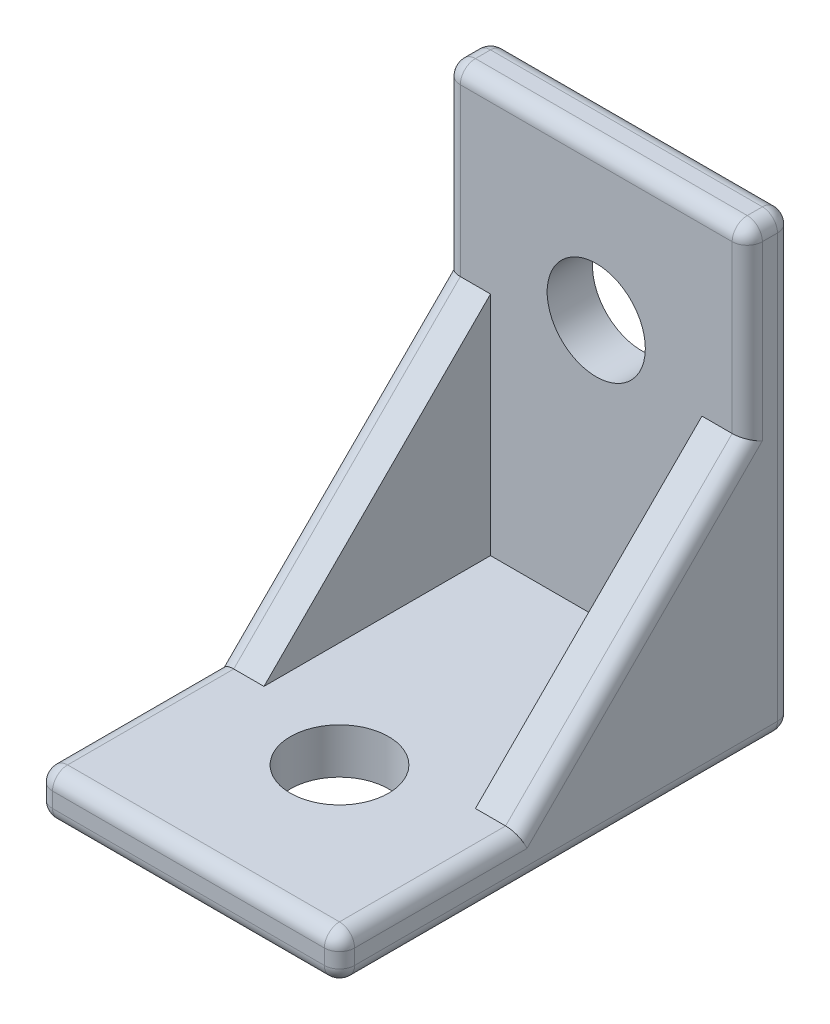
ISO-10303-21;
HEADER;
FILE_DESCRIPTION(('STEP AP214'),'2;1');
FILE_NAME('part.step','',(''),(''),'','','');
FILE_SCHEMA(('AUTOMOTIVE_DESIGN { 1 0 10303 214 1 1 1 1 }'));
ENDSEC;
DATA;
#1=APPLICATION_CONTEXT('core data for automotive mechanical design processes');
#2=APPLICATION_PROTOCOL_DEFINITION('international standard','automotive_design',2000,#1);
#3=PRODUCT_CONTEXT('',#1,'mechanical');
#4=PRODUCT('Part','Part','',(#3));
#5=PRODUCT_RELATED_PRODUCT_CATEGORY('part','',(#4));
#6=PRODUCT_DEFINITION_FORMATION('','',#4);
#7=PRODUCT_DEFINITION_CONTEXT('part definition',#1,'design');
#8=PRODUCT_DEFINITION('design','',#6,#7);
#9=PRODUCT_DEFINITION_SHAPE('','',#8);
#10=(LENGTH_UNIT() NAMED_UNIT(*) SI_UNIT(.MILLI.,.METRE.));
#11=(NAMED_UNIT(*) PLANE_ANGLE_UNIT() SI_UNIT($,.RADIAN.));
#12=(NAMED_UNIT(*) SI_UNIT($,.STERADIAN.) SOLID_ANGLE_UNIT());
#13=UNCERTAINTY_MEASURE_WITH_UNIT(LENGTH_MEASURE(1.E-05),#10,'distance_accuracy_value','');
#14=(GEOMETRIC_REPRESENTATION_CONTEXT(3) GLOBAL_UNCERTAINTY_ASSIGNED_CONTEXT((#13)) GLOBAL_UNIT_ASSIGNED_CONTEXT((#10,
#11,#12)) REPRESENTATION_CONTEXT('',''));
#15=CARTESIAN_POINT('',(0.,0.,0.));
#16=DIRECTION('',(0.,0.,1.));
#17=DIRECTION('',(1.,0.,0.));
#18=AXIS2_PLACEMENT_3D('',#15,#16,#17);
#19=CARTESIAN_POINT('',(0.,3.,0.));
#20=DIRECTION('',(0.,1.,0.));
#21=DIRECTION('',(0.,0.,1.));
#22=AXIS2_PLACEMENT_3D('',#19,#20,#21);
#23=PLANE('',#22);
#24=CARTESIAN_POINT('',(-10.,3.,-10.));
#25=DIRECTION('',(0.,1.,0.));
#26=DIRECTION('',(0.,0.,1.));
#27=AXIS2_PLACEMENT_3D('',#24,#25,#26);
#28=CIRCLE('',#27,3.25);
#29=CARTESIAN_POINT('',(-10.,3.,-6.75));
#30=VERTEX_POINT('',#29);
#31=EDGE_CURVE('E238',#30,#30,#28,.T.);
#32=ORIENTED_EDGE('',*,*,#31,.F.);
#33=EDGE_LOOP('',(#32));
#34=FACE_BOUND('',#33,.T.);
#35=DIRECTION('',(-1.,0.,0.));
#36=VECTOR('',#35,1.);
#37=CARTESIAN_POINT('',(-17.,3.,-12.));
#38=LINE('',#37,#36);
#39=CARTESIAN_POINT('',(-17.,3.,-12.));
#40=VERTEX_POINT('',#39);
#41=CARTESIAN_POINT('',(-19.,3.,-12.));
#42=VERTEX_POINT('',#41);
#43=EDGE_CURVE('E220',#40,#42,#38,.T.);
#44=ORIENTED_EDGE('',*,*,#43,.T.);
#45=DIRECTION('',(0.,0.,1.));
#46=VECTOR('',#45,1.);
#47=CARTESIAN_POINT('',(-19.,3.,0.));
#48=LINE('',#47,#46);
#49=CARTESIAN_POINT('',(-19.,3.,-1.));
#50=VERTEX_POINT('',#49);
#51=EDGE_CURVE('E286',#42,#50,#48,.T.);
#52=ORIENTED_EDGE('',*,*,#51,.T.);
#53=DIRECTION('',(1.,0.,0.));
#54=VECTOR('',#53,1.);
#55=CARTESIAN_POINT('',(0.,3.,-1.));
#56=LINE('',#55,#54);
#57=CARTESIAN_POINT('',(-1.,3.,-1.));
#58=VERTEX_POINT('',#57);
#59=EDGE_CURVE('E283',#50,#58,#56,.T.);
#60=ORIENTED_EDGE('',*,*,#59,.T.);
#61=DIRECTION('',(0.,0.,-1.));
#62=VECTOR('',#61,1.);
#63=CARTESIAN_POINT('',(-1.,3.,-12.));
#64=LINE('',#63,#62);
#65=CARTESIAN_POINT('',(-1.,3.,-12.));
#66=VERTEX_POINT('',#65);
#67=EDGE_CURVE('E280',#58,#66,#64,.T.);
#68=ORIENTED_EDGE('',*,*,#67,.T.);
#69=DIRECTION('',(1.,0.,0.));
#70=VECTOR('',#69,1.);
#71=CARTESIAN_POINT('',(-3.,3.,-12.));
#72=LINE('',#71,#70);
#73=CARTESIAN_POINT('',(-3.,3.,-12.));
#74=VERTEX_POINT('',#73);
#75=EDGE_CURVE('E214',#74,#66,#72,.T.);
#76=ORIENTED_EDGE('',*,*,#75,.F.);
#77=DIRECTION('',(0.,0.,-1.));
#78=VECTOR('',#77,1.);
#79=CARTESIAN_POINT('',(-3.,3.,-27.));
#80=LINE('',#79,#78);
#81=CARTESIAN_POINT('',(-3.,3.,-27.));
#82=VERTEX_POINT('',#81);
#83=EDGE_CURVE('E206',#74,#82,#80,.T.);
#84=ORIENTED_EDGE('',*,*,#83,.T.);
#85=DIRECTION('',(1.,0.,0.));
#86=VECTOR('',#85,1.);
#87=CARTESIAN_POINT('',(-20.,3.,-27.));
#88=LINE('',#87,#86);
#89=CARTESIAN_POINT('',(-17.,3.,-27.));
#90=VERTEX_POINT('',#89);
#91=EDGE_CURVE('E188',#90,#82,#88,.T.);
#92=ORIENTED_EDGE('',*,*,#91,.F.);
#93=DIRECTION('',(0.,0.,-1.));
#94=VECTOR('',#93,1.);
#95=CARTESIAN_POINT('',(-17.,3.,-27.));
#96=LINE('',#95,#94);
#97=EDGE_CURVE('E490',#40,#90,#96,.T.);
#98=ORIENTED_EDGE('',*,*,#97,.F.);
#99=EDGE_LOOP('',(#44,#52,#60,#68,#76,#84,#92,#98));
#100=FACE_BOUND('',#99,.T.);
#101=ADVANCED_FACE('F38',(#34,#100),#23,.T.);
#102=CARTESIAN_POINT('',(-20.,30.,-27.));
#103=DIRECTION('',(0.,0.,-1.));
#104=DIRECTION('',(-1.,0.,0.));
#105=AXIS2_PLACEMENT_3D('',#102,#103,#104);
#106=PLANE('',#105);
#107=CARTESIAN_POINT('',(-10.,20.,-27.));
#108=DIRECTION('',(0.,0.,1.));
#109=DIRECTION('',(1.,0.,0.));
#110=AXIS2_PLACEMENT_3D('',#107,#108,#109);
#111=CIRCLE('',#110,3.25);
#112=CARTESIAN_POINT('',(-6.75,20.,-27.));
#113=VERTEX_POINT('',#112);
#114=EDGE_CURVE('E229',#113,#113,#111,.T.);
#115=ORIENTED_EDGE('',*,*,#114,.F.);
#116=EDGE_LOOP('',(#115));
#117=FACE_BOUND('',#116,.T.);
#118=DIRECTION('',(1.,0.,0.));
#119=VECTOR('',#118,1.);
#120=CARTESIAN_POINT('',(-20.,29.,-27.));
#121=LINE('',#120,#119);
#122=CARTESIAN_POINT('',(-1.,29.,-27.));
#123=VERTEX_POINT('',#122);
#124=CARTESIAN_POINT('',(-19.,29.,-27.));
#125=VERTEX_POINT('',#124);
#126=EDGE_CURVE('E274',#123,#125,#121,.F.);
#127=ORIENTED_EDGE('',*,*,#126,.T.);
#128=DIRECTION('',(0.,-1.,0.));
#129=VECTOR('',#128,1.);
#130=CARTESIAN_POINT('',(-19.,30.,-27.));
#131=LINE('',#130,#129);
#132=CARTESIAN_POINT('',(-19.,18.,-27.));
#133=VERTEX_POINT('',#132);
#134=EDGE_CURVE('E277',#125,#133,#131,.T.);
#135=ORIENTED_EDGE('',*,*,#134,.T.);
#136=DIRECTION('',(-1.,0.,0.));
#137=VECTOR('',#136,1.);
#138=CARTESIAN_POINT('',(-17.,18.,-27.));
#139=LINE('',#138,#137);
#140=CARTESIAN_POINT('',(-17.,18.,-27.));
#141=VERTEX_POINT('',#140);
#142=EDGE_CURVE('E216',#141,#133,#139,.T.);
#143=ORIENTED_EDGE('',*,*,#142,.F.);
#144=DIRECTION('',(0.,1.,0.));
#145=VECTOR('',#144,1.);
#146=CARTESIAN_POINT('',(-17.,18.,-27.));
#147=LINE('',#146,#145);
#148=EDGE_CURVE('E195',#90,#141,#147,.T.);
#149=ORIENTED_EDGE('',*,*,#148,.F.);
#150=ORIENTED_EDGE('',*,*,#91,.T.);
#151=DIRECTION('',(0.,1.,0.));
#152=VECTOR('',#151,1.);
#153=CARTESIAN_POINT('',(-3.,18.,-27.));
#154=LINE('',#153,#152);
#155=CARTESIAN_POINT('',(-3.,18.,-27.));
#156=VERTEX_POINT('',#155);
#157=EDGE_CURVE('E193',#82,#156,#154,.T.);
#158=ORIENTED_EDGE('',*,*,#157,.T.);
#159=DIRECTION('',(1.,0.,0.));
#160=VECTOR('',#159,1.);
#161=CARTESIAN_POINT('',(-3.,18.,-27.));
#162=LINE('',#161,#160);
#163=CARTESIAN_POINT('',(-1.,18.,-27.));
#164=VERTEX_POINT('',#163);
#165=EDGE_CURVE('E226',#156,#164,#162,.T.);
#166=ORIENTED_EDGE('',*,*,#165,.T.);
#167=DIRECTION('',(0.,-1.,0.));
#168=VECTOR('',#167,1.);
#169=CARTESIAN_POINT('',(-1.,30.,-27.));
#170=LINE('',#169,#168);
#171=EDGE_CURVE('E271',#164,#123,#170,.F.);
#172=ORIENTED_EDGE('',*,*,#171,.T.);
#173=EDGE_LOOP('',(#127,#135,#143,#149,#150,#158,#166,#172));
#174=FACE_BOUND('',#173,.T.);
#175=ADVANCED_FACE('F191',(#117,#174),#106,.F.);
#176=CARTESIAN_POINT('',(0.,0.,0.));
#177=DIRECTION('',(0.,1.,0.));
#178=DIRECTION('',(0.,0.,1.));
#179=AXIS2_PLACEMENT_3D('',#176,#177,#178);
#180=PLANE('',#179);
#181=DIRECTION('',(0.,0.,-1.));
#182=VECTOR('',#181,1.);
#183=CARTESIAN_POINT('',(-1.,0.,0.));
#184=LINE('',#183,#182);
#185=CARTESIAN_POINT('',(-1.,0.,-29.));
#186=VERTEX_POINT('',#185);
#187=CARTESIAN_POINT('',(-1.,0.,-1.));
#188=VERTEX_POINT('',#187);
#189=EDGE_CURVE('E305',#186,#188,#184,.F.);
#190=ORIENTED_EDGE('',*,*,#189,.T.);
#191=DIRECTION('',(1.,0.,0.));
#192=VECTOR('',#191,1.);
#193=CARTESIAN_POINT('',(0.,0.,-1.));
#194=LINE('',#193,#192);
#195=CARTESIAN_POINT('',(-19.,0.,-1.));
#196=VERTEX_POINT('',#195);
#197=EDGE_CURVE('E311',#188,#196,#194,.F.);
#198=ORIENTED_EDGE('',*,*,#197,.T.);
#199=DIRECTION('',(0.,0.,1.));
#200=VECTOR('',#199,1.);
#201=CARTESIAN_POINT('',(-19.,0.,0.));
#202=LINE('',#201,#200);
#203=CARTESIAN_POINT('',(-19.,0.,-29.));
#204=VERTEX_POINT('',#203);
#205=EDGE_CURVE('E308',#196,#204,#202,.F.);
#206=ORIENTED_EDGE('',*,*,#205,.T.);
#207=DIRECTION('',(-1.,0.,0.));
#208=VECTOR('',#207,1.);
#209=CARTESIAN_POINT('',(0.,0.,-29.));
#210=LINE('',#209,#208);
#211=EDGE_CURVE('E302',#204,#186,#210,.F.);
#212=ORIENTED_EDGE('',*,*,#211,.T.);
#213=EDGE_LOOP('',(#190,#198,#206,#212));
#214=FACE_BOUND('',#213,.T.);
#215=CARTESIAN_POINT('',(-10.,0.,-10.));
#216=DIRECTION('',(0.,1.,0.));
#217=DIRECTION('',(0.,0.,1.));
#218=AXIS2_PLACEMENT_3D('',#215,#216,#217);
#219=CIRCLE('',#218,3.25);
#220=CARTESIAN_POINT('',(-10.,0.,-6.75));
#221=VERTEX_POINT('',#220);
#222=EDGE_CURVE('E200',#221,#221,#219,.T.);
#223=ORIENTED_EDGE('',*,*,#222,.T.);
#224=EDGE_LOOP('',(#223));
#225=FACE_BOUND('',#224,.T.);
#226=ADVANCED_FACE('F607',(#214,#225),#180,.F.);
#227=CARTESIAN_POINT('',(0.,3.,0.));
#228=DIRECTION('',(-1.,0.,0.));
#229=DIRECTION('',(0.,0.,1.));
#230=AXIS2_PLACEMENT_3D('',#227,#228,#229);
#231=PLANE('',#230);
#232=DIRECTION('',(0.,0.,-1.));
#233=VECTOR('',#232,1.);
#234=CARTESIAN_POINT('',(0.,2.,0.));
#235=LINE('',#234,#233);
#236=CARTESIAN_POINT('',(0.,2.,-12.4142135623731));
#237=VERTEX_POINT('',#236);
#238=CARTESIAN_POINT('',(0.,2.,-1.));
#239=VERTEX_POINT('',#238);
#240=EDGE_CURVE('E56',#237,#239,#235,.F.);
#241=ORIENTED_EDGE('',*,*,#240,.T.);
#242=DIRECTION('',(0.,-1.,0.));
#243=VECTOR('',#242,1.);
#244=CARTESIAN_POINT('',(0.,3.,-1.));
#245=LINE('',#244,#243);
#246=CARTESIAN_POINT('',(0.,1.,-1.));
#247=VERTEX_POINT('',#246);
#248=EDGE_CURVE('E48',#239,#247,#245,.T.);
#249=ORIENTED_EDGE('',*,*,#248,.T.);
#250=DIRECTION('',(0.,0.,-1.));
#251=VECTOR('',#250,1.);
#252=CARTESIAN_POINT('',(0.,1.,0.));
#253=LINE('',#252,#251);
#254=CARTESIAN_POINT('',(0.,1.,-29.));
#255=VERTEX_POINT('',#254);
#256=EDGE_CURVE('E340',#247,#255,#253,.T.);
#257=ORIENTED_EDGE('',*,*,#256,.T.);
#258=DIRECTION('',(0.,-1.,0.));
#259=VECTOR('',#258,1.);
#260=CARTESIAN_POINT('',(0.,3.,-29.));
#261=LINE('',#260,#259);
#262=CARTESIAN_POINT('',(0.,29.,-29.));
#263=VERTEX_POINT('',#262);
#264=EDGE_CURVE('E343',#255,#263,#261,.F.);
#265=ORIENTED_EDGE('',*,*,#264,.T.);
#266=DIRECTION('',(0.,0.,-1.));
#267=VECTOR('',#266,1.);
#268=CARTESIAN_POINT('',(0.,29.,-27.));
#269=LINE('',#268,#267);
#270=CARTESIAN_POINT('',(0.,29.,-28.));
#271=VERTEX_POINT('',#270);
#272=EDGE_CURVE('E346',#263,#271,#269,.F.);
#273=ORIENTED_EDGE('',*,*,#272,.T.);
#274=DIRECTION('',(0.,-1.,0.));
#275=VECTOR('',#274,1.);
#276=CARTESIAN_POINT('',(0.,3.,-28.));
#277=LINE('',#276,#275);
#278=CARTESIAN_POINT('',(0.,17.5857864376269,-28.));
#279=VERTEX_POINT('',#278);
#280=EDGE_CURVE('E349',#271,#279,#277,.T.);
#281=ORIENTED_EDGE('',*,*,#280,.T.);
#282=DIRECTION('',(0.,-0.707106781186548,0.707106781186547));
#283=VECTOR('',#282,1.);
#284=CARTESIAN_POINT('',(0.,2.29289321881345,-12.7071067811866));
#285=LINE('',#284,#283);
#286=EDGE_CURVE('E61',#279,#237,#285,.T.);
#287=ORIENTED_EDGE('',*,*,#286,.T.);
#288=EDGE_LOOP('',(#241,#249,#257,#265,#273,#281,#287));
#289=FACE_BOUND('',#288,.T.);
#290=ADVANCED_FACE('F544',(#289),#231,.F.);
#291=CARTESIAN_POINT('',(0.,3.,-30.));
#292=DIRECTION('',(0.,0.,1.));
#293=DIRECTION('',(1.,0.,0.));
#294=AXIS2_PLACEMENT_3D('',#291,#292,#293);
#295=PLANE('',#294);
#296=DIRECTION('',(0.,-1.,0.));
#297=VECTOR('',#296,1.);
#298=CARTESIAN_POINT('',(-19.,3.,-30.));
#299=LINE('',#298,#297);
#300=CARTESIAN_POINT('',(-19.,1.,-30.));
#301=VERTEX_POINT('',#300);
#302=CARTESIAN_POINT('',(-19.,29.,-30.));
#303=VERTEX_POINT('',#302);
#304=EDGE_CURVE('E264',#301,#303,#299,.F.);
#305=ORIENTED_EDGE('',*,*,#304,.T.);
#306=DIRECTION('',(-1.,0.,0.));
#307=VECTOR('',#306,1.);
#308=CARTESIAN_POINT('',(0.,29.,-30.));
#309=LINE('',#308,#307);
#310=CARTESIAN_POINT('',(-1.,29.,-30.));
#311=VERTEX_POINT('',#310);
#312=EDGE_CURVE('E267',#303,#311,#309,.F.);
#313=ORIENTED_EDGE('',*,*,#312,.T.);
#314=DIRECTION('',(0.,-1.,0.));
#315=VECTOR('',#314,1.);
#316=CARTESIAN_POINT('',(-1.,3.,-30.));
#317=LINE('',#316,#315);
#318=CARTESIAN_POINT('',(-1.,1.,-30.));
#319=VERTEX_POINT('',#318);
#320=EDGE_CURVE('E261',#311,#319,#317,.T.);
#321=ORIENTED_EDGE('',*,*,#320,.T.);
#322=DIRECTION('',(-1.,0.,0.));
#323=VECTOR('',#322,1.);
#324=CARTESIAN_POINT('',(0.,1.,-30.));
#325=LINE('',#324,#323);
#326=EDGE_CURVE('E258',#319,#301,#325,.T.);
#327=ORIENTED_EDGE('',*,*,#326,.T.);
#328=EDGE_LOOP('',(#305,#313,#321,#327));
#329=FACE_BOUND('',#328,.T.);
#330=CARTESIAN_POINT('',(-10.,20.,-30.));
#331=DIRECTION('',(0.,0.,1.));
#332=DIRECTION('',(1.,0.,0.));
#333=AXIS2_PLACEMENT_3D('',#330,#331,#332);
#334=CIRCLE('',#333,3.25);
#335=CARTESIAN_POINT('',(-6.75,20.,-30.));
#336=VERTEX_POINT('',#335);
#337=EDGE_CURVE('E201',#336,#336,#334,.T.);
#338=ORIENTED_EDGE('',*,*,#337,.T.);
#339=EDGE_LOOP('',(#338));
#340=FACE_BOUND('',#339,.T.);
#341=ADVANCED_FACE('F621',(#329,#340),#295,.F.);
#342=CARTESIAN_POINT('',(-20.,3.,0.));
#343=DIRECTION('',(1.,0.,0.));
#344=DIRECTION('',(0.,0.,-1.));
#345=AXIS2_PLACEMENT_3D('',#342,#343,#344);
#346=PLANE('',#345);
#347=DIRECTION('',(0.,0.,1.));
#348=VECTOR('',#347,1.);
#349=CARTESIAN_POINT('',(-20.,1.,0.));
#350=LINE('',#349,#348);
#351=CARTESIAN_POINT('',(-20.,1.,-29.));
#352=VERTEX_POINT('',#351);
#353=CARTESIAN_POINT('',(-20.,1.,-1.));
#354=VERTEX_POINT('',#353);
#355=EDGE_CURVE('E330',#352,#354,#350,.T.);
#356=ORIENTED_EDGE('',*,*,#355,.T.);
#357=DIRECTION('',(0.,-1.,0.));
#358=VECTOR('',#357,1.);
#359=CARTESIAN_POINT('',(-20.,3.,-1.));
#360=LINE('',#359,#358);
#361=CARTESIAN_POINT('',(-20.,2.,-1.));
#362=VERTEX_POINT('',#361);
#363=EDGE_CURVE('E333',#354,#362,#360,.F.);
#364=ORIENTED_EDGE('',*,*,#363,.T.);
#365=DIRECTION('',(0.,0.,1.));
#366=VECTOR('',#365,1.);
#367=CARTESIAN_POINT('',(-20.,2.,-12.));
#368=LINE('',#367,#366);
#369=CARTESIAN_POINT('',(-20.,2.,-12.4142135623731));
#370=VERTEX_POINT('',#369);
#371=EDGE_CURVE('E315',#362,#370,#368,.F.);
#372=ORIENTED_EDGE('',*,*,#371,.T.);
#373=DIRECTION('',(0.,-0.707106781186548,0.707106781186547));
#374=VECTOR('',#373,1.);
#375=CARTESIAN_POINT('',(-20.,-3.70710678118655,-6.70710678118655));
#376=LINE('',#375,#374);
#377=CARTESIAN_POINT('',(-20.,17.5857864376269,-28.));
#378=VERTEX_POINT('',#377);
#379=EDGE_CURVE('E318',#370,#378,#376,.F.);
#380=ORIENTED_EDGE('',*,*,#379,.T.);
#381=DIRECTION('',(0.,-1.,0.));
#382=VECTOR('',#381,1.);
#383=CARTESIAN_POINT('',(-20.,3.,-28.));
#384=LINE('',#383,#382);
#385=CARTESIAN_POINT('',(-20.,29.,-28.));
#386=VERTEX_POINT('',#385);
#387=EDGE_CURVE('E321',#378,#386,#384,.F.);
#388=ORIENTED_EDGE('',*,*,#387,.T.);
#389=DIRECTION('',(0.,0.,1.));
#390=VECTOR('',#389,1.);
#391=CARTESIAN_POINT('',(-20.,29.,-30.));
#392=LINE('',#391,#390);
#393=CARTESIAN_POINT('',(-20.,29.,-29.));
#394=VERTEX_POINT('',#393);
#395=EDGE_CURVE('E324',#386,#394,#392,.F.);
#396=ORIENTED_EDGE('',*,*,#395,.T.);
#397=DIRECTION('',(0.,-1.,0.));
#398=VECTOR('',#397,1.);
#399=CARTESIAN_POINT('',(-20.,3.,-29.));
#400=LINE('',#399,#398);
#401=EDGE_CURVE('E327',#394,#352,#400,.T.);
#402=ORIENTED_EDGE('',*,*,#401,.T.);
#403=EDGE_LOOP('',(#356,#364,#372,#380,#388,#396,#402));
#404=FACE_BOUND('',#403,.T.);
#405=ADVANCED_FACE('F520',(#404),#346,.F.);
#406=CARTESIAN_POINT('',(0.,3.,0.));
#407=DIRECTION('',(0.,0.,-1.));
#408=DIRECTION('',(-1.,0.,0.));
#409=AXIS2_PLACEMENT_3D('',#406,#407,#408);
#410=PLANE('',#409);
#411=DIRECTION('',(1.,0.,0.));
#412=VECTOR('',#411,1.);
#413=CARTESIAN_POINT('',(-20.,2.,0.));
#414=LINE('',#413,#412);
#415=CARTESIAN_POINT('',(-1.,2.,0.));
#416=VERTEX_POINT('',#415);
#417=CARTESIAN_POINT('',(-19.,2.,0.));
#418=VERTEX_POINT('',#417);
#419=EDGE_CURVE('E295',#416,#418,#414,.F.);
#420=ORIENTED_EDGE('',*,*,#419,.T.);
#421=DIRECTION('',(0.,-1.,0.));
#422=VECTOR('',#421,1.);
#423=CARTESIAN_POINT('',(-19.,3.,0.));
#424=LINE('',#423,#422);
#425=CARTESIAN_POINT('',(-19.,1.,0.));
#426=VERTEX_POINT('',#425);
#427=EDGE_CURVE('E299',#418,#426,#424,.T.);
#428=ORIENTED_EDGE('',*,*,#427,.T.);
#429=DIRECTION('',(1.,0.,0.));
#430=VECTOR('',#429,1.);
#431=CARTESIAN_POINT('',(0.,1.,0.));
#432=LINE('',#431,#430);
#433=CARTESIAN_POINT('',(-1.,1.,0.));
#434=VERTEX_POINT('',#433);
#435=EDGE_CURVE('E292',#426,#434,#432,.T.);
#436=ORIENTED_EDGE('',*,*,#435,.T.);
#437=DIRECTION('',(0.,-1.,0.));
#438=VECTOR('',#437,1.);
#439=CARTESIAN_POINT('',(-1.,3.,0.));
#440=LINE('',#439,#438);
#441=EDGE_CURVE('E289',#434,#416,#440,.F.);
#442=ORIENTED_EDGE('',*,*,#441,.T.);
#443=EDGE_LOOP('',(#420,#428,#436,#442));
#444=FACE_BOUND('',#443,.T.);
#445=ADVANCED_FACE('F529',(#444),#410,.F.);
#446=CARTESIAN_POINT('',(-10.,3.,-10.));
#447=DIRECTION('',(0.,-1.,0.));
#448=DIRECTION('',(0.,0.,-1.));
#449=AXIS2_PLACEMENT_3D('',#446,#447,#448);
#450=CYLINDRICAL_SURFACE('',#449,3.25);
#451=ORIENTED_EDGE('',*,*,#31,.T.);
#452=EDGE_LOOP('',(#451));
#453=FACE_BOUND('',#452,.T.);
#454=ORIENTED_EDGE('',*,*,#222,.F.);
#455=EDGE_LOOP('',(#454));
#456=FACE_BOUND('',#455,.T.);
#457=ADVANCED_FACE('F613',(#453,#456),#450,.F.);
#458=CARTESIAN_POINT('',(0.,30.,0.));
#459=DIRECTION('',(0.,1.,0.));
#460=DIRECTION('',(0.,0.,1.));
#461=AXIS2_PLACEMENT_3D('',#458,#459,#460);
#462=PLANE('',#461);
#463=DIRECTION('',(-1.,0.,0.));
#464=VECTOR('',#463,1.);
#465=CARTESIAN_POINT('',(-20.,30.,-29.));
#466=LINE('',#465,#464);
#467=CARTESIAN_POINT('',(-1.,30.,-29.));
#468=VERTEX_POINT('',#467);
#469=CARTESIAN_POINT('',(-19.,30.,-29.));
#470=VERTEX_POINT('',#469);
#471=EDGE_CURVE('E251',#468,#470,#466,.T.);
#472=ORIENTED_EDGE('',*,*,#471,.T.);
#473=DIRECTION('',(0.,0.,1.));
#474=VECTOR('',#473,1.);
#475=CARTESIAN_POINT('',(-19.,30.,-27.));
#476=LINE('',#475,#474);
#477=CARTESIAN_POINT('',(-19.,30.,-28.));
#478=VERTEX_POINT('',#477);
#479=EDGE_CURVE('E255',#470,#478,#476,.T.);
#480=ORIENTED_EDGE('',*,*,#479,.T.);
#481=DIRECTION('',(1.,0.,0.));
#482=VECTOR('',#481,1.);
#483=CARTESIAN_POINT('',(0.,30.,-28.));
#484=LINE('',#483,#482);
#485=CARTESIAN_POINT('',(-1.,30.,-28.));
#486=VERTEX_POINT('',#485);
#487=EDGE_CURVE('E248',#478,#486,#484,.T.);
#488=ORIENTED_EDGE('',*,*,#487,.T.);
#489=DIRECTION('',(0.,0.,-1.));
#490=VECTOR('',#489,1.);
#491=CARTESIAN_POINT('',(-1.,30.,-30.));
#492=LINE('',#491,#490);
#493=EDGE_CURVE('E242',#486,#468,#492,.T.);
#494=ORIENTED_EDGE('',*,*,#493,.T.);
#495=EDGE_LOOP('',(#472,#480,#488,#494));
#496=FACE_BOUND('',#495,.T.);
#497=ADVANCED_FACE('F937',(#496),#462,.T.);
#498=CARTESIAN_POINT('',(-10.,20.,-30.));
#499=DIRECTION('',(0.,0.,1.));
#500=DIRECTION('',(1.,0.,0.));
#501=AXIS2_PLACEMENT_3D('',#498,#499,#500);
#502=CYLINDRICAL_SURFACE('',#501,3.25);
#503=ORIENTED_EDGE('',*,*,#337,.F.);
#504=EDGE_LOOP('',(#503));
#505=FACE_BOUND('',#504,.T.);
#506=ORIENTED_EDGE('',*,*,#114,.T.);
#507=EDGE_LOOP('',(#506));
#508=FACE_BOUND('',#507,.T.);
#509=ADVANCED_FACE('F921',(#505,#508),#502,.F.);
#510=CARTESIAN_POINT('',(-3.,3.,-12.));
#511=DIRECTION('',(0.,0.707106781186547,0.707106781186548));
#512=DIRECTION('',(0.,-0.707106781186548,0.707106781186547));
#513=AXIS2_PLACEMENT_3D('',#510,#511,#512);
#514=PLANE('',#513);
#515=ORIENTED_EDGE('',*,*,#75,.T.);
#516=DIRECTION('',(0.,-0.707106781186548,0.707106781186547));
#517=VECTOR('',#516,1.);
#518=CARTESIAN_POINT('',(-1.,18.,-27.));
#519=LINE('',#518,#517);
#520=EDGE_CURVE('E11',#66,#164,#519,.F.);
#521=ORIENTED_EDGE('',*,*,#520,.T.);
#522=ORIENTED_EDGE('',*,*,#165,.F.);
#523=DIRECTION('',(0.,-0.707106781186548,0.707106781186547));
#524=VECTOR('',#523,1.);
#525=CARTESIAN_POINT('',(-3.,3.,-12.));
#526=LINE('',#525,#524);
#527=EDGE_CURVE('E208',#156,#74,#526,.T.);
#528=ORIENTED_EDGE('',*,*,#527,.T.);
#529=EDGE_LOOP('',(#515,#521,#522,#528));
#530=FACE_BOUND('',#529,.T.);
#531=ADVANCED_FACE('F912',(#530),#514,.T.);
#532=CARTESIAN_POINT('',(-3.,0.,0.));
#533=DIRECTION('',(1.,0.,0.));
#534=DIRECTION('',(0.,0.,-1.));
#535=AXIS2_PLACEMENT_3D('',#532,#533,#534);
#536=PLANE('',#535);
#537=ORIENTED_EDGE('',*,*,#83,.F.);
#538=ORIENTED_EDGE('',*,*,#527,.F.);
#539=ORIENTED_EDGE('',*,*,#157,.F.);
#540=EDGE_LOOP('',(#537,#538,#539));
#541=FACE_BOUND('',#540,.T.);
#542=ADVANCED_FACE('F205',(#541),#536,.F.);
#543=CARTESIAN_POINT('',(-17.,3.,-12.));
#544=DIRECTION('',(0.,-0.707106781186547,-0.707106781186548));
#545=DIRECTION('',(0.,0.707106781186548,-0.707106781186547));
#546=AXIS2_PLACEMENT_3D('',#543,#544,#545);
#547=PLANE('',#546);
#548=ORIENTED_EDGE('',*,*,#142,.T.);
#549=DIRECTION('',(0.,-0.707106781186548,0.707106781186547));
#550=VECTOR('',#549,1.);
#551=CARTESIAN_POINT('',(-19.,3.,-12.));
#552=LINE('',#551,#550);
#553=EDGE_CURVE('E337',#133,#42,#552,.T.);
#554=ORIENTED_EDGE('',*,*,#553,.T.);
#555=ORIENTED_EDGE('',*,*,#43,.F.);
#556=DIRECTION('',(0.,-0.707106781186548,0.707106781186547));
#557=VECTOR('',#556,1.);
#558=CARTESIAN_POINT('',(-17.,3.,-12.));
#559=LINE('',#558,#557);
#560=EDGE_CURVE('E496',#141,#40,#559,.T.);
#561=ORIENTED_EDGE('',*,*,#560,.F.);
#562=EDGE_LOOP('',(#548,#554,#555,#561));
#563=FACE_BOUND('',#562,.T.);
#564=ADVANCED_FACE('F875',(#563),#547,.F.);
#565=CARTESIAN_POINT('',(-17.,0.,0.));
#566=DIRECTION('',(-1.,0.,0.));
#567=DIRECTION('',(0.,0.,-1.));
#568=AXIS2_PLACEMENT_3D('',#565,#566,#567);
#569=PLANE('',#568);
#570=ORIENTED_EDGE('',*,*,#97,.T.);
#571=ORIENTED_EDGE('',*,*,#148,.T.);
#572=ORIENTED_EDGE('',*,*,#560,.T.);
#573=EDGE_LOOP('',(#570,#571,#572));
#574=FACE_BOUND('',#573,.T.);
#575=ADVANCED_FACE('F598',(#574),#569,.F.);
#576=CARTESIAN_POINT('',(0.,2.,-1.));
#577=DIRECTION('',(-1.,0.,0.));
#578=DIRECTION('',(0.,0.,1.));
#579=AXIS2_PLACEMENT_3D('',#576,#577,#578);
#580=CYLINDRICAL_SURFACE('',#579,1.);
#581=CARTESIAN_POINT('',(-1.,2.,-1.));
#582=DIRECTION('',(1.,0.,0.));
#583=DIRECTION('',(0.,0.,-1.));
#584=AXIS2_PLACEMENT_3D('',#581,#582,#583);
#585=CIRCLE('',#584,1.);
#586=EDGE_CURVE('E42',#58,#416,#585,.T.);
#587=ORIENTED_EDGE('',*,*,#586,.F.);
#588=ORIENTED_EDGE('',*,*,#59,.F.);
#589=CARTESIAN_POINT('',(-19.,2.,-1.));
#590=DIRECTION('',(-1.,0.,0.));
#591=DIRECTION('',(0.,0.,1.));
#592=AXIS2_PLACEMENT_3D('',#589,#590,#591);
#593=CIRCLE('',#592,1.);
#594=EDGE_CURVE('E481',#418,#50,#593,.T.);
#595=ORIENTED_EDGE('',*,*,#594,.F.);
#596=ORIENTED_EDGE('',*,*,#419,.F.);
#597=EDGE_LOOP('',(#587,#588,#595,#596));
#598=FACE_BOUND('',#597,.T.);
#599=ADVANCED_FACE('F40',(#598),#580,.T.);
#600=CARTESIAN_POINT('',(-1.,2.,-1.));
#601=DIRECTION('',(0.,0.,1.));
#602=DIRECTION('',(1.,0.,0.));
#603=AXIS2_PLACEMENT_3D('',#600,#601,#602);
#604=SPHERICAL_SURFACE('',#603,1.);
#605=CARTESIAN_POINT('',(-1.,2.,-1.));
#606=DIRECTION('',(0.,0.,1.));
#607=DIRECTION('',(1.,0.,0.));
#608=AXIS2_PLACEMENT_3D('',#605,#606,#607);
#609=CIRCLE('',#608,1.);
#610=EDGE_CURVE('E475',#58,#239,#609,.F.);
#611=ORIENTED_EDGE('',*,*,#610,.F.);
#612=ORIENTED_EDGE('',*,*,#586,.T.);
#613=CARTESIAN_POINT('',(-1.,2.,-1.));
#614=DIRECTION('',(0.,1.,0.));
#615=DIRECTION('',(0.,0.,1.));
#616=AXIS2_PLACEMENT_3D('',#613,#614,#615);
#617=CIRCLE('',#616,1.);
#618=EDGE_CURVE('E478',#239,#416,#617,.F.);
#619=ORIENTED_EDGE('',*,*,#618,.F.);
#620=EDGE_LOOP('',(#611,#612,#619));
#621=FACE_BOUND('',#620,.T.);
#622=ADVANCED_FACE('F591',(#621),#604,.T.);
#623=CARTESIAN_POINT('',(-19.,2.,-1.));
#624=DIRECTION('',(0.,0.,1.));
#625=DIRECTION('',(1.,0.,0.));
#626=AXIS2_PLACEMENT_3D('',#623,#624,#625);
#627=SPHERICAL_SURFACE('',#626,1.);
#628=CARTESIAN_POINT('',(-19.,2.,-1.));
#629=DIRECTION('',(0.,1.,0.));
#630=DIRECTION('',(0.,0.,1.));
#631=AXIS2_PLACEMENT_3D('',#628,#629,#630);
#632=CIRCLE('',#631,1.);
#633=EDGE_CURVE('E467',#418,#362,#632,.F.);
#634=ORIENTED_EDGE('',*,*,#633,.F.);
#635=ORIENTED_EDGE('',*,*,#594,.T.);
#636=CARTESIAN_POINT('',(-19.,2.,-1.));
#637=DIRECTION('',(0.,0.,1.));
#638=DIRECTION('',(1.,0.,0.));
#639=AXIS2_PLACEMENT_3D('',#636,#637,#638);
#640=CIRCLE('',#639,1.);
#641=EDGE_CURVE('E471',#362,#50,#640,.F.);
#642=ORIENTED_EDGE('',*,*,#641,.F.);
#643=EDGE_LOOP('',(#634,#635,#642));
#644=FACE_BOUND('',#643,.T.);
#645=ADVANCED_FACE('F523',(#644),#627,.T.);
#646=CARTESIAN_POINT('',(-1.,3.,-1.));
#647=DIRECTION('',(0.,-1.,0.));
#648=DIRECTION('',(0.,0.,-1.));
#649=AXIS2_PLACEMENT_3D('',#646,#647,#648);
#650=CYLINDRICAL_SURFACE('',#649,1.);
#651=ORIENTED_EDGE('',*,*,#618,.T.);
#652=ORIENTED_EDGE('',*,*,#441,.F.);
#653=CARTESIAN_POINT('',(-1.,1.,-1.));
#654=DIRECTION('',(0.,-1.,0.));
#655=DIRECTION('',(0.,0.,-1.));
#656=AXIS2_PLACEMENT_3D('',#653,#654,#655);
#657=CIRCLE('',#656,1.);
#658=EDGE_CURVE('E459',#247,#434,#657,.T.);
#659=ORIENTED_EDGE('',*,*,#658,.F.);
#660=ORIENTED_EDGE('',*,*,#248,.F.);
#661=EDGE_LOOP('',(#651,#652,#659,#660));
#662=FACE_BOUND('',#661,.T.);
#663=ADVANCED_FACE('F543',(#662),#650,.T.);
#664=CARTESIAN_POINT('',(-1.,2.,0.));
#665=DIRECTION('',(0.,0.,1.));
#666=DIRECTION('',(1.,0.,0.));
#667=AXIS2_PLACEMENT_3D('',#664,#665,#666);
#668=CYLINDRICAL_SURFACE('',#667,1.);
#669=ORIENTED_EDGE('',*,*,#610,.T.);
#670=ORIENTED_EDGE('',*,*,#240,.F.);
#671=CARTESIAN_POINT('',(-1.,2.,-12.4142135623731));
#672=DIRECTION('',(0.,-0.38268343236509,0.923879532511287));
#673=DIRECTION('',(0.,0.923879532511287,0.38268343236509));
#674=AXIS2_PLACEMENT_3D('',#671,#672,#673);
#675=ELLIPSE('',#674,1.08239220029239,1.);
#676=EDGE_CURVE('E455',#66,#237,#675,.F.);
#677=ORIENTED_EDGE('',*,*,#676,.F.);
#678=ORIENTED_EDGE('',*,*,#67,.F.);
#679=EDGE_LOOP('',(#669,#670,#677,#678));
#680=FACE_BOUND('',#679,.T.);
#681=ADVANCED_FACE('F590',(#680),#668,.T.);
#682=CARTESIAN_POINT('',(-19.,2.,0.));
#683=DIRECTION('',(0.,0.,-1.));
#684=DIRECTION('',(-1.,0.,0.));
#685=AXIS2_PLACEMENT_3D('',#682,#683,#684);
#686=CYLINDRICAL_SURFACE('',#685,1.);
#687=ORIENTED_EDGE('',*,*,#641,.T.);
#688=ORIENTED_EDGE('',*,*,#51,.F.);
#689=CARTESIAN_POINT('',(-19.,2.,-12.4142135623731));
#690=DIRECTION('',(0.,-0.38268343236509,0.923879532511287));
#691=DIRECTION('',(0.,-0.923879532511287,-0.38268343236509));
#692=AXIS2_PLACEMENT_3D('',#689,#690,#691);
#693=ELLIPSE('',#692,1.08239220029239,1.);
#694=EDGE_CURVE('E451',#370,#42,#693,.F.);
#695=ORIENTED_EDGE('',*,*,#694,.F.);
#696=ORIENTED_EDGE('',*,*,#371,.F.);
#697=EDGE_LOOP('',(#687,#688,#695,#696));
#698=FACE_BOUND('',#697,.T.);
#699=ADVANCED_FACE('F512',(#698),#686,.T.);
#700=CARTESIAN_POINT('',(-19.,3.,-1.));
#701=DIRECTION('',(0.,-1.,0.));
#702=DIRECTION('',(0.,0.,-1.));
#703=AXIS2_PLACEMENT_3D('',#700,#701,#702);
#704=CYLINDRICAL_SURFACE('',#703,1.);
#705=ORIENTED_EDGE('',*,*,#633,.T.);
#706=ORIENTED_EDGE('',*,*,#363,.F.);
#707=CARTESIAN_POINT('',(-19.,1.,-1.));
#708=DIRECTION('',(0.,-1.,0.));
#709=DIRECTION('',(0.,0.,-1.));
#710=AXIS2_PLACEMENT_3D('',#707,#708,#709);
#711=CIRCLE('',#710,1.);
#712=EDGE_CURVE('E447',#426,#354,#711,.T.);
#713=ORIENTED_EDGE('',*,*,#712,.F.);
#714=ORIENTED_EDGE('',*,*,#427,.F.);
#715=EDGE_LOOP('',(#705,#706,#713,#714));
#716=FACE_BOUND('',#715,.T.);
#717=ADVANCED_FACE('F525',(#716),#704,.T.);
#718=CARTESIAN_POINT('',(0.,1.,-1.));
#719=DIRECTION('',(1.,0.,0.));
#720=DIRECTION('',(0.,0.,-1.));
#721=AXIS2_PLACEMENT_3D('',#718,#719,#720);
#722=CYLINDRICAL_SURFACE('',#721,1.);
#723=CARTESIAN_POINT('',(-1.,1.,-1.));
#724=DIRECTION('',(1.,0.,0.));
#725=DIRECTION('',(0.,0.,-1.));
#726=AXIS2_PLACEMENT_3D('',#723,#724,#725);
#727=CIRCLE('',#726,1.);
#728=EDGE_CURVE('E463',#434,#188,#727,.T.);
#729=ORIENTED_EDGE('',*,*,#728,.F.);
#730=ORIENTED_EDGE('',*,*,#435,.F.);
#731=CARTESIAN_POINT('',(-19.,1.,-1.));
#732=DIRECTION('',(-1.,0.,0.));
#733=DIRECTION('',(0.,0.,1.));
#734=AXIS2_PLACEMENT_3D('',#731,#732,#733);
#735=CIRCLE('',#734,1.);
#736=EDGE_CURVE('E443',#196,#426,#735,.T.);
#737=ORIENTED_EDGE('',*,*,#736,.F.);
#738=ORIENTED_EDGE('',*,*,#197,.F.);
#739=EDGE_LOOP('',(#729,#730,#737,#738));
#740=FACE_BOUND('',#739,.T.);
#741=ADVANCED_FACE('F535',(#740),#722,.T.);
#742=CARTESIAN_POINT('',(-1.,1.,-1.));
#743=DIRECTION('',(0.,0.,1.));
#744=DIRECTION('',(1.,0.,0.));
#745=AXIS2_PLACEMENT_3D('',#742,#743,#744);
#746=SPHERICAL_SURFACE('',#745,1.);
#747=ORIENTED_EDGE('',*,*,#658,.T.);
#748=ORIENTED_EDGE('',*,*,#728,.T.);
#749=CARTESIAN_POINT('',(-1.,1.,-1.));
#750=DIRECTION('',(0.,0.,1.));
#751=DIRECTION('',(1.,0.,0.));
#752=AXIS2_PLACEMENT_3D('',#749,#750,#751);
#753=CIRCLE('',#752,1.);
#754=EDGE_CURVE('E439',#247,#188,#753,.F.);
#755=ORIENTED_EDGE('',*,*,#754,.F.);
#756=EDGE_LOOP('',(#747,#748,#755));
#757=FACE_BOUND('',#756,.T.);
#758=ADVANCED_FACE('F540',(#757),#746,.T.);
#759=CARTESIAN_POINT('',(-1.,-3.70710678118655,-6.70710678118655));
#760=DIRECTION('',(0.,0.707106781186548,-0.707106781186547));
#761=DIRECTION('',(0.,0.707106781186547,0.707106781186548));
#762=AXIS2_PLACEMENT_3D('',#759,#760,#761);
#763=CYLINDRICAL_SURFACE('',#762,1.);
#764=ORIENTED_EDGE('',*,*,#676,.T.);
#765=ORIENTED_EDGE('',*,*,#286,.F.);
#766=CARTESIAN_POINT('',(-1.,17.5857864376269,-28.));
#767=DIRECTION('',(0.,0.923879532511287,-0.38268343236509));
#768=DIRECTION('',(0.,-0.38268343236509,-0.923879532511287));
#769=AXIS2_PLACEMENT_3D('',#766,#767,#768);
#770=ELLIPSE('',#769,1.08239220029239,1.);
#771=EDGE_CURVE('E435',#164,#279,#770,.T.);
#772=ORIENTED_EDGE('',*,*,#771,.F.);
#773=ORIENTED_EDGE('',*,*,#520,.F.);
#774=EDGE_LOOP('',(#764,#765,#772,#773));
#775=FACE_BOUND('',#774,.T.);
#776=ADVANCED_FACE('F586',(#775),#763,.T.);
#777=CARTESIAN_POINT('',(-19.,2.29289321881345,-12.7071067811865));
#778=DIRECTION('',(0.,-0.707106781186548,0.707106781186547));
#779=DIRECTION('',(0.,-0.707106781186547,-0.707106781186548));
#780=AXIS2_PLACEMENT_3D('',#777,#778,#779);
#781=CYLINDRICAL_SURFACE('',#780,1.);
#782=ORIENTED_EDGE('',*,*,#694,.T.);
#783=ORIENTED_EDGE('',*,*,#553,.F.);
#784=CARTESIAN_POINT('',(-19.,17.5857864376269,-28.));
#785=DIRECTION('',(0.,-0.923879532511287,0.38268343236509));
#786=DIRECTION('',(0.,-0.38268343236509,-0.923879532511287));
#787=AXIS2_PLACEMENT_3D('',#784,#785,#786);
#788=ELLIPSE('',#787,1.08239220029239,1.);
#789=EDGE_CURVE('E431',#378,#133,#788,.F.);
#790=ORIENTED_EDGE('',*,*,#789,.F.);
#791=ORIENTED_EDGE('',*,*,#379,.F.);
#792=EDGE_LOOP('',(#782,#783,#790,#791));
#793=FACE_BOUND('',#792,.T.);
#794=ADVANCED_FACE('F516',(#793),#781,.T.);
#795=CARTESIAN_POINT('',(-19.,1.,-1.));
#796=DIRECTION('',(0.,0.,1.));
#797=DIRECTION('',(1.,0.,0.));
#798=AXIS2_PLACEMENT_3D('',#795,#796,#797);
#799=SPHERICAL_SURFACE('',#798,1.);
#800=ORIENTED_EDGE('',*,*,#736,.T.);
#801=ORIENTED_EDGE('',*,*,#712,.T.);
#802=CARTESIAN_POINT('',(-19.,1.,-1.));
#803=DIRECTION('',(0.,0.,1.));
#804=DIRECTION('',(1.,0.,0.));
#805=AXIS2_PLACEMENT_3D('',#802,#803,#804);
#806=CIRCLE('',#805,1.);
#807=EDGE_CURVE('E427',#196,#354,#806,.F.);
#808=ORIENTED_EDGE('',*,*,#807,.F.);
#809=EDGE_LOOP('',(#800,#801,#808));
#810=FACE_BOUND('',#809,.T.);
#811=ADVANCED_FACE('F679',(#810),#799,.T.);
#812=CARTESIAN_POINT('',(-1.,1.,0.));
#813=DIRECTION('',(0.,0.,-1.));
#814=DIRECTION('',(-1.,0.,0.));
#815=AXIS2_PLACEMENT_3D('',#812,#813,#814);
#816=CYLINDRICAL_SURFACE('',#815,1.);
#817=ORIENTED_EDGE('',*,*,#754,.T.);
#818=ORIENTED_EDGE('',*,*,#189,.F.);
#819=CARTESIAN_POINT('',(-1.,1.,-29.));
#820=DIRECTION('',(0.,0.,-1.));
#821=DIRECTION('',(-1.,0.,0.));
#822=AXIS2_PLACEMENT_3D('',#819,#820,#821);
#823=CIRCLE('',#822,1.);
#824=EDGE_CURVE('E419',#255,#186,#823,.T.);
#825=ORIENTED_EDGE('',*,*,#824,.F.);
#826=ORIENTED_EDGE('',*,*,#256,.F.);
#827=EDGE_LOOP('',(#817,#818,#825,#826));
#828=FACE_BOUND('',#827,.T.);
#829=ADVANCED_FACE('F551',(#828),#816,.T.);
#830=CARTESIAN_POINT('',(-1.,3.,-28.));
#831=DIRECTION('',(0.,-1.,0.));
#832=DIRECTION('',(0.,0.,-1.));
#833=AXIS2_PLACEMENT_3D('',#830,#831,#832);
#834=CYLINDRICAL_SURFACE('',#833,1.);
#835=ORIENTED_EDGE('',*,*,#771,.T.);
#836=ORIENTED_EDGE('',*,*,#280,.F.);
#837=CARTESIAN_POINT('',(-1.,29.,-28.));
#838=DIRECTION('',(0.,1.,0.));
#839=DIRECTION('',(0.,0.,1.));
#840=AXIS2_PLACEMENT_3D('',#837,#838,#839);
#841=CIRCLE('',#840,1.);
#842=EDGE_CURVE('E415',#123,#271,#841,.T.);
#843=ORIENTED_EDGE('',*,*,#842,.F.);
#844=ORIENTED_EDGE('',*,*,#171,.F.);
#845=EDGE_LOOP('',(#835,#836,#843,#844));
#846=FACE_BOUND('',#845,.T.);
#847=ADVANCED_FACE('F571',(#846),#834,.T.);
#848=CARTESIAN_POINT('',(0.,29.,-28.));
#849=DIRECTION('',(-1.,0.,0.));
#850=DIRECTION('',(0.,0.,1.));
#851=AXIS2_PLACEMENT_3D('',#848,#849,#850);
#852=CYLINDRICAL_SURFACE('',#851,1.);
#853=CARTESIAN_POINT('',(-19.,29.,-28.));
#854=DIRECTION('',(-1.,0.,0.));
#855=DIRECTION('',(0.,0.,1.));
#856=AXIS2_PLACEMENT_3D('',#853,#854,#855);
#857=CIRCLE('',#856,1.);
#858=EDGE_CURVE('E407',#125,#478,#857,.T.);
#859=ORIENTED_EDGE('',*,*,#858,.F.);
#860=ORIENTED_EDGE('',*,*,#126,.F.);
#861=CARTESIAN_POINT('',(-1.,29.,-28.));
#862=DIRECTION('',(1.,0.,0.));
#863=DIRECTION('',(0.,0.,-1.));
#864=AXIS2_PLACEMENT_3D('',#861,#862,#863);
#865=CIRCLE('',#864,1.);
#866=EDGE_CURVE('E411',#486,#123,#865,.T.);
#867=ORIENTED_EDGE('',*,*,#866,.F.);
#868=ORIENTED_EDGE('',*,*,#487,.F.);
#869=EDGE_LOOP('',(#859,#860,#867,#868));
#870=FACE_BOUND('',#869,.T.);
#871=ADVANCED_FACE('F581',(#870),#852,.T.);
#872=CARTESIAN_POINT('',(-19.,30.,-28.));
#873=DIRECTION('',(0.,-1.,0.));
#874=DIRECTION('',(0.,0.,-1.));
#875=AXIS2_PLACEMENT_3D('',#872,#873,#874);
#876=CYLINDRICAL_SURFACE('',#875,1.);
#877=ORIENTED_EDGE('',*,*,#789,.T.);
#878=ORIENTED_EDGE('',*,*,#134,.F.);
#879=CARTESIAN_POINT('',(-19.,29.,-28.));
#880=DIRECTION('',(0.,1.,0.));
#881=DIRECTION('',(0.,0.,1.));
#882=AXIS2_PLACEMENT_3D('',#879,#880,#881);
#883=CIRCLE('',#882,1.);
#884=EDGE_CURVE('E404',#386,#125,#883,.T.);
#885=ORIENTED_EDGE('',*,*,#884,.F.);
#886=ORIENTED_EDGE('',*,*,#387,.F.);
#887=EDGE_LOOP('',(#877,#878,#885,#886));
#888=FACE_BOUND('',#887,.T.);
#889=ADVANCED_FACE('F668',(#888),#876,.T.);
#890=CARTESIAN_POINT('',(-19.,1.,0.));
#891=DIRECTION('',(0.,0.,1.));
#892=DIRECTION('',(1.,0.,0.));
#893=AXIS2_PLACEMENT_3D('',#890,#891,#892);
#894=CYLINDRICAL_SURFACE('',#893,1.);
#895=ORIENTED_EDGE('',*,*,#807,.T.);
#896=ORIENTED_EDGE('',*,*,#355,.F.);
#897=CARTESIAN_POINT('',(-19.,1.,-29.));
#898=DIRECTION('',(0.,0.,-1.));
#899=DIRECTION('',(-1.,0.,0.));
#900=AXIS2_PLACEMENT_3D('',#897,#898,#899);
#901=CIRCLE('',#900,1.);
#902=EDGE_CURVE('E400',#204,#352,#901,.T.);
#903=ORIENTED_EDGE('',*,*,#902,.F.);
#904=ORIENTED_EDGE('',*,*,#205,.F.);
#905=EDGE_LOOP('',(#895,#896,#903,#904));
#906=FACE_BOUND('',#905,.T.);
#907=ADVANCED_FACE('F664',(#906),#894,.T.);
#908=CARTESIAN_POINT('',(0.,1.,-29.));
#909=DIRECTION('',(-1.,0.,0.));
#910=DIRECTION('',(0.,0.,1.));
#911=AXIS2_PLACEMENT_3D('',#908,#909,#910);
#912=CYLINDRICAL_SURFACE('',#911,1.);
#913=CARTESIAN_POINT('',(-1.,1.,-29.));
#914=DIRECTION('',(1.,0.,0.));
#915=DIRECTION('',(0.,0.,-1.));
#916=AXIS2_PLACEMENT_3D('',#913,#914,#915);
#917=CIRCLE('',#916,1.);
#918=EDGE_CURVE('E423',#186,#319,#917,.T.);
#919=ORIENTED_EDGE('',*,*,#918,.F.);
#920=ORIENTED_EDGE('',*,*,#211,.F.);
#921=CARTESIAN_POINT('',(-19.,1.,-29.));
#922=DIRECTION('',(-1.,0.,0.));
#923=DIRECTION('',(0.,0.,1.));
#924=AXIS2_PLACEMENT_3D('',#921,#922,#923);
#925=CIRCLE('',#924,1.);
#926=EDGE_CURVE('E396',#301,#204,#925,.T.);
#927=ORIENTED_EDGE('',*,*,#926,.F.);
#928=ORIENTED_EDGE('',*,*,#326,.F.);
#929=EDGE_LOOP('',(#919,#920,#927,#928));
#930=FACE_BOUND('',#929,.T.);
#931=ADVANCED_FACE('F661',(#930),#912,.T.);
#932=CARTESIAN_POINT('',(-1.,1.,-29.));
#933=DIRECTION('',(0.,0.,1.));
#934=DIRECTION('',(1.,0.,0.));
#935=AXIS2_PLACEMENT_3D('',#932,#933,#934);
#936=SPHERICAL_SURFACE('',#935,1.);
#937=ORIENTED_EDGE('',*,*,#824,.T.);
#938=ORIENTED_EDGE('',*,*,#918,.T.);
#939=CARTESIAN_POINT('',(-1.,1.,-29.));
#940=DIRECTION('',(0.,-1.,0.));
#941=DIRECTION('',(0.,0.,-1.));
#942=AXIS2_PLACEMENT_3D('',#939,#940,#941);
#943=CIRCLE('',#942,1.);
#944=EDGE_CURVE('E392',#255,#319,#943,.F.);
#945=ORIENTED_EDGE('',*,*,#944,.F.);
#946=EDGE_LOOP('',(#937,#938,#945));
#947=FACE_BOUND('',#946,.T.);
#948=ADVANCED_FACE('F554',(#947),#936,.T.);
#949=CARTESIAN_POINT('',(-1.,29.,-28.));
#950=DIRECTION('',(0.,0.,1.));
#951=DIRECTION('',(1.,0.,0.));
#952=AXIS2_PLACEMENT_3D('',#949,#950,#951);
#953=SPHERICAL_SURFACE('',#952,1.);
#954=ORIENTED_EDGE('',*,*,#866,.T.);
#955=ORIENTED_EDGE('',*,*,#842,.T.);
#956=CARTESIAN_POINT('',(-1.,29.,-28.));
#957=DIRECTION('',(0.,0.,1.));
#958=DIRECTION('',(1.,0.,0.));
#959=AXIS2_PLACEMENT_3D('',#956,#957,#958);
#960=CIRCLE('',#959,1.);
#961=EDGE_CURVE('E388',#486,#271,#960,.F.);
#962=ORIENTED_EDGE('',*,*,#961,.F.);
#963=EDGE_LOOP('',(#954,#955,#962));
#964=FACE_BOUND('',#963,.T.);
#965=ADVANCED_FACE('F575',(#964),#953,.T.);
#966=CARTESIAN_POINT('',(-19.,29.,-28.));
#967=DIRECTION('',(0.,0.,1.));
#968=DIRECTION('',(1.,0.,0.));
#969=AXIS2_PLACEMENT_3D('',#966,#967,#968);
#970=SPHERICAL_SURFACE('',#969,1.);
#971=ORIENTED_EDGE('',*,*,#884,.T.);
#972=ORIENTED_EDGE('',*,*,#858,.T.);
#973=CARTESIAN_POINT('',(-19.,29.,-28.));
#974=DIRECTION('',(0.,0.,1.));
#975=DIRECTION('',(1.,0.,0.));
#976=AXIS2_PLACEMENT_3D('',#973,#974,#975);
#977=CIRCLE('',#976,1.);
#978=EDGE_CURVE('E384',#386,#478,#977,.F.);
#979=ORIENTED_EDGE('',*,*,#978,.F.);
#980=EDGE_LOOP('',(#971,#972,#979));
#981=FACE_BOUND('',#980,.T.);
#982=ADVANCED_FACE('F652',(#981),#970,.T.);
#983=CARTESIAN_POINT('',(-19.,1.,-29.));
#984=DIRECTION('',(0.,0.,1.));
#985=DIRECTION('',(1.,0.,0.));
#986=AXIS2_PLACEMENT_3D('',#983,#984,#985);
#987=SPHERICAL_SURFACE('',#986,1.);
#988=ORIENTED_EDGE('',*,*,#926,.T.);
#989=ORIENTED_EDGE('',*,*,#902,.T.);
#990=CARTESIAN_POINT('',(-19.,1.,-29.));
#991=DIRECTION('',(0.,-1.,0.));
#992=DIRECTION('',(0.,0.,-1.));
#993=AXIS2_PLACEMENT_3D('',#990,#991,#992);
#994=CIRCLE('',#993,1.);
#995=EDGE_CURVE('E380',#301,#352,#994,.F.);
#996=ORIENTED_EDGE('',*,*,#995,.F.);
#997=EDGE_LOOP('',(#988,#989,#996));
#998=FACE_BOUND('',#997,.T.);
#999=ADVANCED_FACE('F649',(#998),#987,.T.);
#1000=CARTESIAN_POINT('',(-1.,3.,-29.));
#1001=DIRECTION('',(0.,-1.,0.));
#1002=DIRECTION('',(0.,0.,-1.));
#1003=AXIS2_PLACEMENT_3D('',#1000,#1001,#1002);
#1004=CYLINDRICAL_SURFACE('',#1003,1.);
#1005=ORIENTED_EDGE('',*,*,#944,.T.);
#1006=ORIENTED_EDGE('',*,*,#320,.F.);
#1007=CARTESIAN_POINT('',(-1.,29.,-29.));
#1008=DIRECTION('',(0.,1.,0.));
#1009=DIRECTION('',(0.,0.,1.));
#1010=AXIS2_PLACEMENT_3D('',#1007,#1008,#1009);
#1011=CIRCLE('',#1010,1.);
#1012=EDGE_CURVE('E376',#263,#311,#1011,.T.);
#1013=ORIENTED_EDGE('',*,*,#1012,.F.);
#1014=ORIENTED_EDGE('',*,*,#264,.F.);
#1015=EDGE_LOOP('',(#1005,#1006,#1013,#1014));
#1016=FACE_BOUND('',#1015,.T.);
#1017=ADVANCED_FACE('F558',(#1016),#1004,.T.);
#1018=CARTESIAN_POINT('',(-1.,29.,0.));
#1019=DIRECTION('',(0.,0.,1.));
#1020=DIRECTION('',(1.,0.,0.));
#1021=AXIS2_PLACEMENT_3D('',#1018,#1019,#1020);
#1022=CYLINDRICAL_SURFACE('',#1021,1.);
#1023=ORIENTED_EDGE('',*,*,#961,.T.);
#1024=ORIENTED_EDGE('',*,*,#272,.F.);
#1025=CARTESIAN_POINT('',(-1.,29.,-29.));
#1026=DIRECTION('',(0.,0.,-1.));
#1027=DIRECTION('',(-1.,0.,0.));
#1028=AXIS2_PLACEMENT_3D('',#1025,#1026,#1027);
#1029=CIRCLE('',#1028,1.);
#1030=EDGE_CURVE('E372',#468,#263,#1029,.T.);
#1031=ORIENTED_EDGE('',*,*,#1030,.F.);
#1032=ORIENTED_EDGE('',*,*,#493,.F.);
#1033=EDGE_LOOP('',(#1023,#1024,#1031,#1032));
#1034=FACE_BOUND('',#1033,.T.);
#1035=ADVANCED_FACE('F566',(#1034),#1022,.T.);
#1036=CARTESIAN_POINT('',(-19.,29.,0.));
#1037=DIRECTION('',(0.,0.,-1.));
#1038=DIRECTION('',(-1.,0.,0.));
#1039=AXIS2_PLACEMENT_3D('',#1036,#1037,#1038);
#1040=CYLINDRICAL_SURFACE('',#1039,1.);
#1041=ORIENTED_EDGE('',*,*,#978,.T.);
#1042=ORIENTED_EDGE('',*,*,#479,.F.);
#1043=CARTESIAN_POINT('',(-19.,29.,-29.));
#1044=DIRECTION('',(0.,0.,-1.));
#1045=DIRECTION('',(-1.,0.,0.));
#1046=AXIS2_PLACEMENT_3D('',#1043,#1044,#1045);
#1047=CIRCLE('',#1046,1.);
#1048=EDGE_CURVE('E368',#394,#470,#1047,.T.);
#1049=ORIENTED_EDGE('',*,*,#1048,.F.);
#1050=ORIENTED_EDGE('',*,*,#395,.F.);
#1051=EDGE_LOOP('',(#1041,#1042,#1049,#1050));
#1052=FACE_BOUND('',#1051,.T.);
#1053=ADVANCED_FACE('F640',(#1052),#1040,.T.);
#1054=CARTESIAN_POINT('',(-19.,3.,-29.));
#1055=DIRECTION('',(0.,-1.,0.));
#1056=DIRECTION('',(0.,0.,-1.));
#1057=AXIS2_PLACEMENT_3D('',#1054,#1055,#1056);
#1058=CYLINDRICAL_SURFACE('',#1057,1.);
#1059=ORIENTED_EDGE('',*,*,#995,.T.);
#1060=ORIENTED_EDGE('',*,*,#401,.F.);
#1061=CARTESIAN_POINT('',(-19.,29.,-29.));
#1062=DIRECTION('',(0.,1.,0.));
#1063=DIRECTION('',(0.,0.,1.));
#1064=AXIS2_PLACEMENT_3D('',#1061,#1062,#1063);
#1065=CIRCLE('',#1064,1.);
#1066=EDGE_CURVE('E364',#303,#394,#1065,.T.);
#1067=ORIENTED_EDGE('',*,*,#1066,.F.);
#1068=ORIENTED_EDGE('',*,*,#304,.F.);
#1069=EDGE_LOOP('',(#1059,#1060,#1067,#1068));
#1070=FACE_BOUND('',#1069,.T.);
#1071=ADVANCED_FACE('F637',(#1070),#1058,.T.);
#1072=CARTESIAN_POINT('',(-1.,29.,-29.));
#1073=DIRECTION('',(0.,0.,1.));
#1074=DIRECTION('',(1.,0.,0.));
#1075=AXIS2_PLACEMENT_3D('',#1072,#1073,#1074);
#1076=SPHERICAL_SURFACE('',#1075,1.);
#1077=ORIENTED_EDGE('',*,*,#1030,.T.);
#1078=ORIENTED_EDGE('',*,*,#1012,.T.);
#1079=CARTESIAN_POINT('',(-1.,29.,-29.));
#1080=DIRECTION('',(1.,0.,0.));
#1081=DIRECTION('',(0.,0.,-1.));
#1082=AXIS2_PLACEMENT_3D('',#1079,#1080,#1081);
#1083=CIRCLE('',#1082,1.);
#1084=EDGE_CURVE('E361',#468,#311,#1083,.F.);
#1085=ORIENTED_EDGE('',*,*,#1084,.F.);
#1086=EDGE_LOOP('',(#1077,#1078,#1085));
#1087=FACE_BOUND('',#1086,.T.);
#1088=ADVANCED_FACE('F562',(#1087),#1076,.T.);
#1089=CARTESIAN_POINT('',(-19.,29.,-29.));
#1090=DIRECTION('',(0.,0.,1.));
#1091=DIRECTION('',(1.,0.,0.));
#1092=AXIS2_PLACEMENT_3D('',#1089,#1090,#1091);
#1093=SPHERICAL_SURFACE('',#1092,1.);
#1094=ORIENTED_EDGE('',*,*,#1066,.T.);
#1095=ORIENTED_EDGE('',*,*,#1048,.T.);
#1096=CARTESIAN_POINT('',(-19.,29.,-29.));
#1097=DIRECTION('',(-1.,0.,0.));
#1098=DIRECTION('',(0.,0.,1.));
#1099=AXIS2_PLACEMENT_3D('',#1096,#1097,#1098);
#1100=CIRCLE('',#1099,1.);
#1101=EDGE_CURVE('E358',#303,#470,#1100,.F.);
#1102=ORIENTED_EDGE('',*,*,#1101,.F.);
#1103=EDGE_LOOP('',(#1094,#1095,#1102));
#1104=FACE_BOUND('',#1103,.T.);
#1105=ADVANCED_FACE('F630',(#1104),#1093,.T.);
#1106=CARTESIAN_POINT('',(0.,29.,-29.));
#1107=DIRECTION('',(1.,0.,0.));
#1108=DIRECTION('',(0.,0.,-1.));
#1109=AXIS2_PLACEMENT_3D('',#1106,#1107,#1108);
#1110=CYLINDRICAL_SURFACE('',#1109,1.);
#1111=ORIENTED_EDGE('',*,*,#1084,.T.);
#1112=ORIENTED_EDGE('',*,*,#312,.F.);
#1113=ORIENTED_EDGE('',*,*,#1101,.T.);
#1114=ORIENTED_EDGE('',*,*,#471,.F.);
#1115=EDGE_LOOP('',(#1111,#1112,#1113,#1114));
#1116=FACE_BOUND('',#1115,.T.);
#1117=ADVANCED_FACE('F627',(#1116),#1110,.T.);
#1118=CLOSED_SHELL('',(#101,#175,#226,#290,#341,#405,#445,#457,#497,#509,#531,#542,#564,#575,
#599,#622,#645,#663,#681,#699,#717,#741,#758,#776,#794,#811,#829,#847,#871,#889,#907,#931,#948,
#965,#982,#999,#1017,#1035,#1053,#1071,#1088,#1105,#1117));
#1119=MANIFOLD_SOLID_BREP('B2',#1118);
#1120=ADVANCED_BREP_SHAPE_REPRESENTATION('',(#18,#1119),#14);
#1121=SHAPE_DEFINITION_REPRESENTATION(#9,#1120);
ENDSEC;
END-ISO-10303-21;
